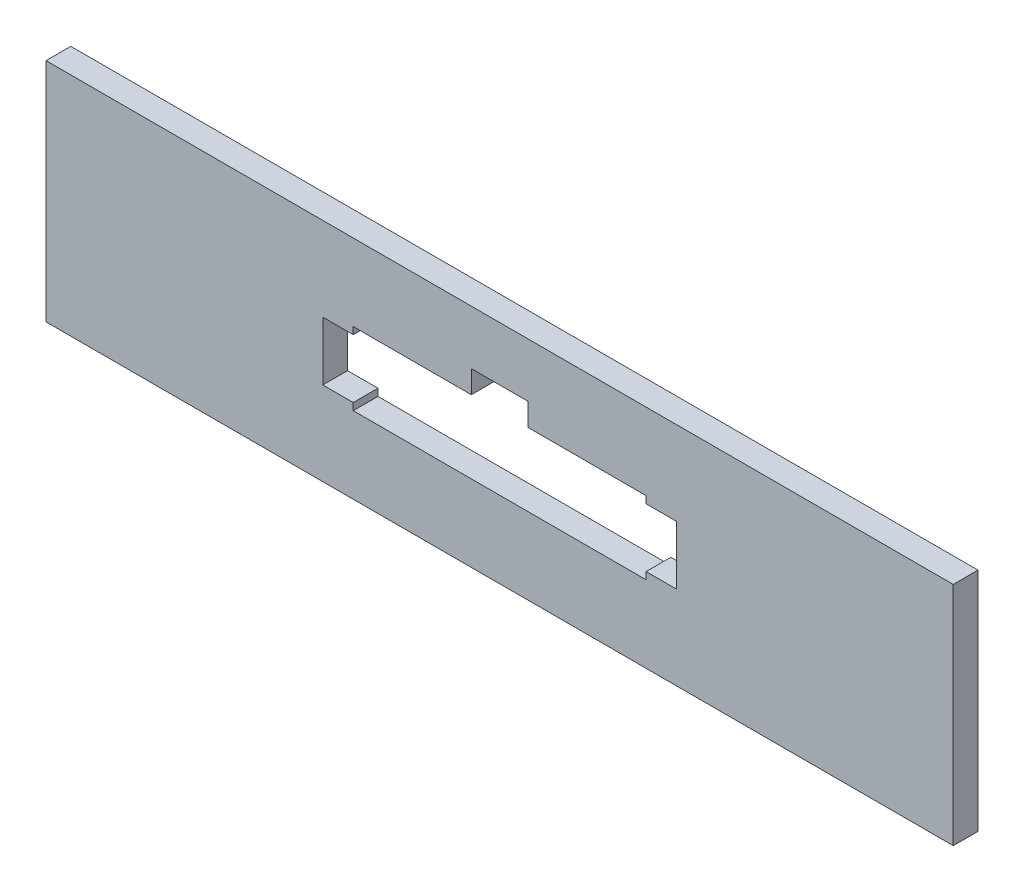
ISO-10303-21;
HEADER;
FILE_DESCRIPTION(('STEP AP214'),'2;1');
FILE_NAME('part.step','',(''),(''),'','','');
FILE_SCHEMA(('AUTOMOTIVE_DESIGN { 1 0 10303 214 1 1 1 1 }'));
ENDSEC;
DATA;
#1=APPLICATION_CONTEXT('core data for automotive mechanical design processes');
#2=APPLICATION_PROTOCOL_DEFINITION('international standard','automotive_design',2000,#1);
#3=PRODUCT_CONTEXT('',#1,'mechanical');
#4=PRODUCT('Part','Part','',(#3));
#5=PRODUCT_RELATED_PRODUCT_CATEGORY('part','',(#4));
#6=PRODUCT_DEFINITION_FORMATION('','',#4);
#7=PRODUCT_DEFINITION_CONTEXT('part definition',#1,'design');
#8=PRODUCT_DEFINITION('design','',#6,#7);
#9=PRODUCT_DEFINITION_SHAPE('','',#8);
#10=(LENGTH_UNIT() NAMED_UNIT(*) SI_UNIT(.MILLI.,.METRE.));
#11=(NAMED_UNIT(*) PLANE_ANGLE_UNIT() SI_UNIT($,.RADIAN.));
#12=(NAMED_UNIT(*) SI_UNIT($,.STERADIAN.) SOLID_ANGLE_UNIT());
#13=UNCERTAINTY_MEASURE_WITH_UNIT(LENGTH_MEASURE(1.E-05),#10,'distance_accuracy_value','');
#14=(GEOMETRIC_REPRESENTATION_CONTEXT(3) GLOBAL_UNCERTAINTY_ASSIGNED_CONTEXT((#13)) GLOBAL_UNIT_ASSIGNED_CONTEXT((#10,
#11,#12)) REPRESENTATION_CONTEXT('',''));
#15=CARTESIAN_POINT('',(0.,0.,0.));
#16=DIRECTION('',(0.,0.,1.));
#17=DIRECTION('',(1.,0.,0.));
#18=AXIS2_PLACEMENT_3D('',#15,#16,#17);
#19=CARTESIAN_POINT('',(0.,0.,1.75));
#20=DIRECTION('',(0.,0.,-1.));
#21=DIRECTION('',(-1.,0.,0.));
#22=AXIS2_PLACEMENT_3D('',#19,#20,#21);
#23=PLANE('',#22);
#24=DIRECTION('',(0.,1.,0.));
#25=VECTOR('',#24,1.);
#26=CARTESIAN_POINT('',(32.0669060003736,-7.99769934349865,1.75));
#27=LINE('',#26,#25);
#28=CARTESIAN_POINT('',(32.0669060003736,-7.99769934349865,1.75));
#29=VERTEX_POINT('',#28);
#30=CARTESIAN_POINT('',(32.0669060003736,7.99769934349865,1.75));
#31=VERTEX_POINT('',#30);
#32=EDGE_CURVE('E291',#29,#31,#27,.T.);
#33=ORIENTED_EDGE('',*,*,#32,.T.);
#34=DIRECTION('',(-1.,0.,0.));
#35=VECTOR('',#34,1.);
#36=CARTESIAN_POINT('',(-32.0669060003736,7.99769934349865,1.75));
#37=LINE('',#36,#35);
#38=CARTESIAN_POINT('',(-32.0669060003736,7.99769934349865,1.75));
#39=VERTEX_POINT('',#38);
#40=EDGE_CURVE('E294',#31,#39,#37,.T.);
#41=ORIENTED_EDGE('',*,*,#40,.T.);
#42=DIRECTION('',(0.,-1.,0.));
#43=VECTOR('',#42,1.);
#44=CARTESIAN_POINT('',(-32.0669060003736,-7.99769934349865,1.75));
#45=LINE('',#44,#43);
#46=CARTESIAN_POINT('',(-32.0669060003736,-7.99769934349865,1.75));
#47=VERTEX_POINT('',#46);
#48=EDGE_CURVE('E297',#39,#47,#45,.T.);
#49=ORIENTED_EDGE('',*,*,#48,.T.);
#50=DIRECTION('',(1.,0.,0.));
#51=VECTOR('',#50,1.);
#52=CARTESIAN_POINT('',(-32.0669060003736,-7.99769934349865,1.75));
#53=LINE('',#52,#51);
#54=EDGE_CURVE('E299',#47,#29,#53,.T.);
#55=ORIENTED_EDGE('',*,*,#54,.T.);
#56=EDGE_LOOP('',(#33,#41,#49,#55));
#57=FACE_BOUND('',#56,.T.);
#58=DIRECTION('',(0.,-1.,0.));
#59=VECTOR('',#58,1.);
#60=CARTESIAN_POINT('',(-10.35,2.075,1.75));
#61=LINE('',#60,#59);
#62=CARTESIAN_POINT('',(-10.35,2.575,1.75));
#63=VERTEX_POINT('',#62);
#64=CARTESIAN_POINT('',(-10.35,2.075,1.75));
#65=VERTEX_POINT('',#64);
#66=EDGE_CURVE('E170',#63,#65,#61,.T.);
#67=ORIENTED_EDGE('',*,*,#66,.F.);
#68=DIRECTION('',(-1.,0.,0.));
#69=VECTOR('',#68,1.);
#70=CARTESIAN_POINT('',(-10.35,2.575,1.75));
#71=LINE('',#70,#69);
#72=CARTESIAN_POINT('',(-2.,2.575,1.75));
#73=VERTEX_POINT('',#72);
#74=EDGE_CURVE('E219',#73,#63,#71,.T.);
#75=ORIENTED_EDGE('',*,*,#74,.F.);
#76=DIRECTION('',(0.,-1.,0.));
#77=VECTOR('',#76,1.);
#78=CARTESIAN_POINT('',(-2.,2.575,1.75));
#79=LINE('',#78,#77);
#80=CARTESIAN_POINT('',(-2.00000000000002,4.17500000000002,1.75));
#81=VERTEX_POINT('',#80);
#82=EDGE_CURVE('E217',#81,#73,#79,.T.);
#83=ORIENTED_EDGE('',*,*,#82,.F.);
#84=DIRECTION('',(-1.,0.,0.));
#85=VECTOR('',#84,1.);
#86=CARTESIAN_POINT('',(-2.00000000000002,4.17500000000002,1.75));
#87=LINE('',#86,#85);
#88=CARTESIAN_POINT('',(1.99999999999998,4.17500000000002,1.75));
#89=VERTEX_POINT('',#88);
#90=EDGE_CURVE('E215',#89,#81,#87,.T.);
#91=ORIENTED_EDGE('',*,*,#90,.F.);
#92=DIRECTION('',(0.,1.,0.));
#93=VECTOR('',#92,1.);
#94=CARTESIAN_POINT('',(2.,2.575,1.75));
#95=LINE('',#94,#93);
#96=CARTESIAN_POINT('',(2.,2.575,1.75));
#97=VERTEX_POINT('',#96);
#98=EDGE_CURVE('E213',#97,#89,#95,.T.);
#99=ORIENTED_EDGE('',*,*,#98,.F.);
#100=DIRECTION('',(-1.,0.,0.));
#101=VECTOR('',#100,1.);
#102=CARTESIAN_POINT('',(2.,2.575,1.75));
#103=LINE('',#102,#101);
#104=CARTESIAN_POINT('',(10.35,2.575,1.75));
#105=VERTEX_POINT('',#104);
#106=EDGE_CURVE('E211',#105,#97,#103,.T.);
#107=ORIENTED_EDGE('',*,*,#106,.F.);
#108=DIRECTION('',(0.,1.,0.));
#109=VECTOR('',#108,1.);
#110=CARTESIAN_POINT('',(10.35,2.075,1.75));
#111=LINE('',#110,#109);
#112=CARTESIAN_POINT('',(10.35,2.075,1.75));
#113=VERTEX_POINT('',#112);
#114=EDGE_CURVE('E209',#113,#105,#111,.T.);
#115=ORIENTED_EDGE('',*,*,#114,.F.);
#116=DIRECTION('',(-1.,0.,0.));
#117=VECTOR('',#116,1.);
#118=CARTESIAN_POINT('',(10.35,2.075,1.75));
#119=LINE('',#118,#117);
#120=CARTESIAN_POINT('',(12.5,2.075,1.75));
#121=VERTEX_POINT('',#120);
#122=EDGE_CURVE('E207',#121,#113,#119,.T.);
#123=ORIENTED_EDGE('',*,*,#122,.F.);
#124=DIRECTION('',(0.,1.,0.));
#125=VECTOR('',#124,1.);
#126=CARTESIAN_POINT('',(12.5,-2.075,1.75));
#127=LINE('',#126,#125);
#128=CARTESIAN_POINT('',(12.5,-2.075,1.75));
#129=VERTEX_POINT('',#128);
#130=EDGE_CURVE('E205',#129,#121,#127,.T.);
#131=ORIENTED_EDGE('',*,*,#130,.F.);
#132=DIRECTION('',(1.,0.,0.));
#133=VECTOR('',#132,1.);
#134=CARTESIAN_POINT('',(10.35,-2.075,1.75));
#135=LINE('',#134,#133);
#136=CARTESIAN_POINT('',(10.35,-2.075,1.75));
#137=VERTEX_POINT('',#136);
#138=EDGE_CURVE('E203',#137,#129,#135,.T.);
#139=ORIENTED_EDGE('',*,*,#138,.F.);
#140=DIRECTION('',(0.,1.,0.));
#141=VECTOR('',#140,1.);
#142=CARTESIAN_POINT('',(10.35,-2.575,1.75));
#143=LINE('',#142,#141);
#144=CARTESIAN_POINT('',(10.35,-2.575,1.75));
#145=VERTEX_POINT('',#144);
#146=EDGE_CURVE('E201',#145,#137,#143,.T.);
#147=ORIENTED_EDGE('',*,*,#146,.F.);
#148=DIRECTION('',(1.,0.,0.));
#149=VECTOR('',#148,1.);
#150=CARTESIAN_POINT('',(-10.35,-2.575,1.75));
#151=LINE('',#150,#149);
#152=CARTESIAN_POINT('',(-10.35,-2.575,1.75));
#153=VERTEX_POINT('',#152);
#154=EDGE_CURVE('E199',#153,#145,#151,.T.);
#155=ORIENTED_EDGE('',*,*,#154,.F.);
#156=DIRECTION('',(0.,-1.,0.));
#157=VECTOR('',#156,1.);
#158=CARTESIAN_POINT('',(-10.35,-2.575,1.75));
#159=LINE('',#158,#157);
#160=CARTESIAN_POINT('',(-10.35,-2.075,1.75));
#161=VERTEX_POINT('',#160);
#162=EDGE_CURVE('E197',#161,#153,#159,.T.);
#163=ORIENTED_EDGE('',*,*,#162,.F.);
#164=DIRECTION('',(1.,0.,0.));
#165=VECTOR('',#164,1.);
#166=CARTESIAN_POINT('',(-12.5,-2.075,1.75));
#167=LINE('',#166,#165);
#168=CARTESIAN_POINT('',(-12.5,-2.075,1.75));
#169=VERTEX_POINT('',#168);
#170=EDGE_CURVE('E193',#169,#161,#167,.T.);
#171=ORIENTED_EDGE('',*,*,#170,.F.);
#172=DIRECTION('',(0.,-1.,0.));
#173=VECTOR('',#172,1.);
#174=CARTESIAN_POINT('',(-12.5,-2.075,1.75));
#175=LINE('',#174,#173);
#176=CARTESIAN_POINT('',(-12.5,2.075,1.75));
#177=VERTEX_POINT('',#176);
#178=EDGE_CURVE('E191',#177,#169,#175,.T.);
#179=ORIENTED_EDGE('',*,*,#178,.F.);
#180=DIRECTION('',(-1.,0.,0.));
#181=VECTOR('',#180,1.);
#182=CARTESIAN_POINT('',(-12.5,2.075,1.75));
#183=LINE('',#182,#181);
#184=EDGE_CURVE('E178',#65,#177,#183,.T.);
#185=ORIENTED_EDGE('',*,*,#184,.F.);
#186=EDGE_LOOP('',(#67,#75,#83,#91,#99,#107,#115,#123,#131,#139,#147,#155,#163,#171,#179,#185));
#187=FACE_BOUND('',#186,.T.);
#188=ADVANCED_FACE('F33',(#57,#187),#23,.F.);
#189=CARTESIAN_POINT('',(0.,0.,0.));
#190=DIRECTION('',(0.,0.,-1.));
#191=DIRECTION('',(-1.,0.,0.));
#192=AXIS2_PLACEMENT_3D('',#189,#190,#191);
#193=PLANE('',#192);
#194=DIRECTION('',(0.,1.,0.));
#195=VECTOR('',#194,1.);
#196=CARTESIAN_POINT('',(32.0669060003736,-7.99769934349865,0.));
#197=LINE('',#196,#195);
#198=CARTESIAN_POINT('',(32.0669060003736,-7.99769934349865,0.));
#199=VERTEX_POINT('',#198);
#200=CARTESIAN_POINT('',(32.0669060003736,7.99769934349865,0.));
#201=VERTEX_POINT('',#200);
#202=EDGE_CURVE('E186',#199,#201,#197,.T.);
#203=ORIENTED_EDGE('',*,*,#202,.F.);
#204=DIRECTION('',(1.,0.,0.));
#205=VECTOR('',#204,1.);
#206=CARTESIAN_POINT('',(-32.0669060003736,-7.99769934349865,0.));
#207=LINE('',#206,#205);
#208=CARTESIAN_POINT('',(-32.0669060003736,-7.99769934349865,0.));
#209=VERTEX_POINT('',#208);
#210=EDGE_CURVE('E295',#209,#199,#207,.T.);
#211=ORIENTED_EDGE('',*,*,#210,.F.);
#212=DIRECTION('',(0.,-1.,0.));
#213=VECTOR('',#212,1.);
#214=CARTESIAN_POINT('',(-32.0669060003736,-7.99769934349865,0.));
#215=LINE('',#214,#213);
#216=CARTESIAN_POINT('',(-32.0669060003736,7.99769934349865,0.));
#217=VERTEX_POINT('',#216);
#218=EDGE_CURVE('E306',#217,#209,#215,.T.);
#219=ORIENTED_EDGE('',*,*,#218,.F.);
#220=DIRECTION('',(-1.,0.,0.));
#221=VECTOR('',#220,1.);
#222=CARTESIAN_POINT('',(-32.0669060003736,7.99769934349865,0.));
#223=LINE('',#222,#221);
#224=EDGE_CURVE('E304',#201,#217,#223,.T.);
#225=ORIENTED_EDGE('',*,*,#224,.F.);
#226=EDGE_LOOP('',(#203,#211,#219,#225));
#227=FACE_BOUND('',#226,.T.);
#228=DIRECTION('',(-1.,0.,0.));
#229=VECTOR('',#228,1.);
#230=CARTESIAN_POINT('',(-10.35,2.575,0.));
#231=LINE('',#230,#229);
#232=CARTESIAN_POINT('',(-2.,2.575,0.));
#233=VERTEX_POINT('',#232);
#234=CARTESIAN_POINT('',(-10.35,2.575,0.));
#235=VERTEX_POINT('',#234);
#236=EDGE_CURVE('E179',#233,#235,#231,.T.);
#237=ORIENTED_EDGE('',*,*,#236,.T.);
#238=DIRECTION('',(0.,-1.,0.));
#239=VECTOR('',#238,1.);
#240=CARTESIAN_POINT('',(-10.35,2.075,0.));
#241=LINE('',#240,#239);
#242=CARTESIAN_POINT('',(-10.35,2.075,0.));
#243=VERTEX_POINT('',#242);
#244=EDGE_CURVE('E56',#235,#243,#241,.T.);
#245=ORIENTED_EDGE('',*,*,#244,.T.);
#246=DIRECTION('',(-1.,0.,0.));
#247=VECTOR('',#246,1.);
#248=CARTESIAN_POINT('',(-12.5,2.075,0.));
#249=LINE('',#248,#247);
#250=CARTESIAN_POINT('',(-12.5,2.075,0.));
#251=VERTEX_POINT('',#250);
#252=EDGE_CURVE('E185',#243,#251,#249,.T.);
#253=ORIENTED_EDGE('',*,*,#252,.T.);
#254=DIRECTION('',(0.,-1.,0.));
#255=VECTOR('',#254,1.);
#256=CARTESIAN_POINT('',(-12.5,-2.075,0.));
#257=LINE('',#256,#255);
#258=CARTESIAN_POINT('',(-12.5,-2.075,0.));
#259=VERTEX_POINT('',#258);
#260=EDGE_CURVE('E223',#251,#259,#257,.T.);
#261=ORIENTED_EDGE('',*,*,#260,.T.);
#262=DIRECTION('',(1.,0.,0.));
#263=VECTOR('',#262,1.);
#264=CARTESIAN_POINT('',(-12.5,-2.075,0.));
#265=LINE('',#264,#263);
#266=CARTESIAN_POINT('',(-10.35,-2.075,0.));
#267=VERTEX_POINT('',#266);
#268=EDGE_CURVE('E226',#259,#267,#265,.T.);
#269=ORIENTED_EDGE('',*,*,#268,.T.);
#270=DIRECTION('',(0.,-1.,0.));
#271=VECTOR('',#270,1.);
#272=CARTESIAN_POINT('',(-10.35,-2.575,0.));
#273=LINE('',#272,#271);
#274=CARTESIAN_POINT('',(-10.35,-2.575,0.));
#275=VERTEX_POINT('',#274);
#276=EDGE_CURVE('E229',#267,#275,#273,.T.);
#277=ORIENTED_EDGE('',*,*,#276,.T.);
#278=DIRECTION('',(1.,0.,0.));
#279=VECTOR('',#278,1.);
#280=CARTESIAN_POINT('',(-10.35,-2.575,0.));
#281=LINE('',#280,#279);
#282=CARTESIAN_POINT('',(10.35,-2.575,0.));
#283=VERTEX_POINT('',#282);
#284=EDGE_CURVE('E232',#275,#283,#281,.T.);
#285=ORIENTED_EDGE('',*,*,#284,.T.);
#286=DIRECTION('',(0.,1.,0.));
#287=VECTOR('',#286,1.);
#288=CARTESIAN_POINT('',(10.35,-2.575,0.));
#289=LINE('',#288,#287);
#290=CARTESIAN_POINT('',(10.35,-2.075,0.));
#291=VERTEX_POINT('',#290);
#292=EDGE_CURVE('E235',#283,#291,#289,.T.);
#293=ORIENTED_EDGE('',*,*,#292,.T.);
#294=DIRECTION('',(1.,0.,0.));
#295=VECTOR('',#294,1.);
#296=CARTESIAN_POINT('',(10.35,-2.075,0.));
#297=LINE('',#296,#295);
#298=CARTESIAN_POINT('',(12.5,-2.075,0.));
#299=VERTEX_POINT('',#298);
#300=EDGE_CURVE('E238',#291,#299,#297,.T.);
#301=ORIENTED_EDGE('',*,*,#300,.T.);
#302=DIRECTION('',(0.,1.,0.));
#303=VECTOR('',#302,1.);
#304=CARTESIAN_POINT('',(12.5,-2.075,0.));
#305=LINE('',#304,#303);
#306=CARTESIAN_POINT('',(12.5,2.075,0.));
#307=VERTEX_POINT('',#306);
#308=EDGE_CURVE('E241',#299,#307,#305,.T.);
#309=ORIENTED_EDGE('',*,*,#308,.T.);
#310=DIRECTION('',(-1.,0.,0.));
#311=VECTOR('',#310,1.);
#312=CARTESIAN_POINT('',(10.35,2.075,0.));
#313=LINE('',#312,#311);
#314=CARTESIAN_POINT('',(10.35,2.075,0.));
#315=VERTEX_POINT('',#314);
#316=EDGE_CURVE('E244',#307,#315,#313,.T.);
#317=ORIENTED_EDGE('',*,*,#316,.T.);
#318=DIRECTION('',(0.,1.,0.));
#319=VECTOR('',#318,1.);
#320=CARTESIAN_POINT('',(10.35,2.075,0.));
#321=LINE('',#320,#319);
#322=CARTESIAN_POINT('',(10.35,2.575,0.));
#323=VERTEX_POINT('',#322);
#324=EDGE_CURVE('E247',#315,#323,#321,.T.);
#325=ORIENTED_EDGE('',*,*,#324,.T.);
#326=DIRECTION('',(-1.,0.,0.));
#327=VECTOR('',#326,1.);
#328=CARTESIAN_POINT('',(2.,2.575,0.));
#329=LINE('',#328,#327);
#330=CARTESIAN_POINT('',(2.,2.575,0.));
#331=VERTEX_POINT('',#330);
#332=EDGE_CURVE('E250',#323,#331,#329,.T.);
#333=ORIENTED_EDGE('',*,*,#332,.T.);
#334=DIRECTION('',(0.,1.,0.));
#335=VECTOR('',#334,1.);
#336=CARTESIAN_POINT('',(2.,2.575,0.));
#337=LINE('',#336,#335);
#338=CARTESIAN_POINT('',(1.99999999999998,4.17500000000002,0.));
#339=VERTEX_POINT('',#338);
#340=EDGE_CURVE('E253',#331,#339,#337,.T.);
#341=ORIENTED_EDGE('',*,*,#340,.T.);
#342=DIRECTION('',(-1.,0.,0.));
#343=VECTOR('',#342,1.);
#344=CARTESIAN_POINT('',(-2.00000000000002,4.17500000000002,0.));
#345=LINE('',#344,#343);
#346=CARTESIAN_POINT('',(-2.00000000000002,4.17500000000002,0.));
#347=VERTEX_POINT('',#346);
#348=EDGE_CURVE('E256',#339,#347,#345,.T.);
#349=ORIENTED_EDGE('',*,*,#348,.T.);
#350=DIRECTION('',(0.,-1.,0.));
#351=VECTOR('',#350,1.);
#352=CARTESIAN_POINT('',(-2.,2.575,0.));
#353=LINE('',#352,#351);
#354=EDGE_CURVE('E259',#347,#233,#353,.T.);
#355=ORIENTED_EDGE('',*,*,#354,.T.);
#356=EDGE_LOOP('',(#237,#245,#253,#261,#269,#277,#285,#293,#301,#309,#317,#325,#333,#341,#349,#355));
#357=FACE_BOUND('',#356,.T.);
#358=ADVANCED_FACE('F324',(#227,#357),#193,.T.);
#359=CARTESIAN_POINT('',(32.0669060003736,-7.99769934349865,1.75));
#360=DIRECTION('',(-1.,0.,0.));
#361=DIRECTION('',(0.,0.,1.));
#362=AXIS2_PLACEMENT_3D('',#359,#360,#361);
#363=PLANE('',#362);
#364=ORIENTED_EDGE('',*,*,#202,.T.);
#365=DIRECTION('',(0.,0.,-1.));
#366=VECTOR('',#365,1.);
#367=CARTESIAN_POINT('',(32.0669060003736,7.99769934349865,1.75));
#368=LINE('',#367,#366);
#369=EDGE_CURVE('E11',#31,#201,#368,.T.);
#370=ORIENTED_EDGE('',*,*,#369,.F.);
#371=ORIENTED_EDGE('',*,*,#32,.F.);
#372=DIRECTION('',(0.,0.,-1.));
#373=VECTOR('',#372,1.);
#374=CARTESIAN_POINT('',(32.0669060003736,-7.99769934349865,1.75));
#375=LINE('',#374,#373);
#376=EDGE_CURVE('E301',#29,#199,#375,.T.);
#377=ORIENTED_EDGE('',*,*,#376,.T.);
#378=EDGE_LOOP('',(#364,#370,#371,#377));
#379=FACE_BOUND('',#378,.T.);
#380=ADVANCED_FACE('F35',(#379),#363,.F.);
#381=CARTESIAN_POINT('',(-32.0669060003736,7.99769934349865,1.75));
#382=DIRECTION('',(0.,-1.,0.));
#383=DIRECTION('',(0.,0.,-1.));
#384=AXIS2_PLACEMENT_3D('',#381,#382,#383);
#385=PLANE('',#384);
#386=ORIENTED_EDGE('',*,*,#224,.T.);
#387=DIRECTION('',(0.,0.,-1.));
#388=VECTOR('',#387,1.);
#389=CARTESIAN_POINT('',(-32.0669060003736,7.99769934349865,1.75));
#390=LINE('',#389,#388);
#391=EDGE_CURVE('E41',#39,#217,#390,.T.);
#392=ORIENTED_EDGE('',*,*,#391,.F.);
#393=ORIENTED_EDGE('',*,*,#40,.F.);
#394=ORIENTED_EDGE('',*,*,#369,.T.);
#395=EDGE_LOOP('',(#386,#392,#393,#394));
#396=FACE_BOUND('',#395,.T.);
#397=ADVANCED_FACE('F334',(#396),#385,.F.);
#398=CARTESIAN_POINT('',(-32.0669060003736,-7.99769934349865,1.75));
#399=DIRECTION('',(1.,0.,0.));
#400=DIRECTION('',(0.,0.,-1.));
#401=AXIS2_PLACEMENT_3D('',#398,#399,#400);
#402=PLANE('',#401);
#403=ORIENTED_EDGE('',*,*,#218,.T.);
#404=DIRECTION('',(0.,0.,-1.));
#405=VECTOR('',#404,1.);
#406=CARTESIAN_POINT('',(-32.0669060003736,-7.99769934349865,1.75));
#407=LINE('',#406,#405);
#408=EDGE_CURVE('E311',#47,#209,#407,.T.);
#409=ORIENTED_EDGE('',*,*,#408,.F.);
#410=ORIENTED_EDGE('',*,*,#48,.F.);
#411=ORIENTED_EDGE('',*,*,#391,.T.);
#412=EDGE_LOOP('',(#403,#409,#410,#411));
#413=FACE_BOUND('',#412,.T.);
#414=ADVANCED_FACE('F318',(#413),#402,.F.);
#415=CARTESIAN_POINT('',(-32.0669060003736,-7.99769934349865,1.75));
#416=DIRECTION('',(0.,1.,0.));
#417=DIRECTION('',(0.,0.,1.));
#418=AXIS2_PLACEMENT_3D('',#415,#416,#417);
#419=PLANE('',#418);
#420=ORIENTED_EDGE('',*,*,#210,.T.);
#421=ORIENTED_EDGE('',*,*,#376,.F.);
#422=ORIENTED_EDGE('',*,*,#54,.F.);
#423=ORIENTED_EDGE('',*,*,#408,.T.);
#424=EDGE_LOOP('',(#420,#421,#422,#423));
#425=FACE_BOUND('',#424,.T.);
#426=ADVANCED_FACE('F328',(#425),#419,.F.);
#427=CARTESIAN_POINT('',(-10.35,2.075,1.75));
#428=DIRECTION('',(1.,0.,0.));
#429=DIRECTION('',(0.,0.,-1.));
#430=AXIS2_PLACEMENT_3D('',#427,#428,#429);
#431=PLANE('',#430);
#432=ORIENTED_EDGE('',*,*,#244,.F.);
#433=DIRECTION('',(0.,0.,-1.));
#434=VECTOR('',#433,1.);
#435=CARTESIAN_POINT('',(-10.35,2.575,1.75));
#436=LINE('',#435,#434);
#437=EDGE_CURVE('E174',#63,#235,#436,.T.);
#438=ORIENTED_EDGE('',*,*,#437,.F.);
#439=ORIENTED_EDGE('',*,*,#66,.T.);
#440=DIRECTION('',(0.,0.,-1.));
#441=VECTOR('',#440,1.);
#442=CARTESIAN_POINT('',(-10.35,2.075,1.75));
#443=LINE('',#442,#441);
#444=EDGE_CURVE('E173',#65,#243,#443,.T.);
#445=ORIENTED_EDGE('',*,*,#444,.T.);
#446=EDGE_LOOP('',(#432,#438,#439,#445));
#447=FACE_BOUND('',#446,.T.);
#448=ADVANCED_FACE('F172',(#447),#431,.T.);
#449=CARTESIAN_POINT('',(-12.5,2.075,1.75));
#450=DIRECTION('',(0.,-1.,0.));
#451=DIRECTION('',(1.,0.,0.));
#452=AXIS2_PLACEMENT_3D('',#449,#450,#451);
#453=PLANE('',#452);
#454=ORIENTED_EDGE('',*,*,#252,.F.);
#455=ORIENTED_EDGE('',*,*,#444,.F.);
#456=ORIENTED_EDGE('',*,*,#184,.T.);
#457=DIRECTION('',(0.,0.,-1.));
#458=VECTOR('',#457,1.);
#459=CARTESIAN_POINT('',(-12.5,2.075,1.75));
#460=LINE('',#459,#458);
#461=EDGE_CURVE('E187',#177,#251,#460,.T.);
#462=ORIENTED_EDGE('',*,*,#461,.T.);
#463=EDGE_LOOP('',(#454,#455,#456,#462));
#464=FACE_BOUND('',#463,.T.);
#465=ADVANCED_FACE('F182',(#464),#453,.T.);
#466=CARTESIAN_POINT('',(-12.5,-2.075,1.75));
#467=DIRECTION('',(1.,0.,0.));
#468=DIRECTION('',(0.,0.,-1.));
#469=AXIS2_PLACEMENT_3D('',#466,#467,#468);
#470=PLANE('',#469);
#471=ORIENTED_EDGE('',*,*,#260,.F.);
#472=ORIENTED_EDGE('',*,*,#461,.F.);
#473=ORIENTED_EDGE('',*,*,#178,.T.);
#474=DIRECTION('',(0.,0.,-1.));
#475=VECTOR('',#474,1.);
#476=CARTESIAN_POINT('',(-12.5,-2.075,1.75));
#477=LINE('',#476,#475);
#478=EDGE_CURVE('E288',#169,#259,#477,.T.);
#479=ORIENTED_EDGE('',*,*,#478,.T.);
#480=EDGE_LOOP('',(#471,#472,#473,#479));
#481=FACE_BOUND('',#480,.T.);
#482=ADVANCED_FACE('F357',(#481),#470,.T.);
#483=CARTESIAN_POINT('',(-12.5,-2.075,1.75));
#484=DIRECTION('',(0.,1.,0.));
#485=DIRECTION('',(-1.,0.,0.));
#486=AXIS2_PLACEMENT_3D('',#483,#484,#485);
#487=PLANE('',#486);
#488=ORIENTED_EDGE('',*,*,#268,.F.);
#489=ORIENTED_EDGE('',*,*,#478,.F.);
#490=ORIENTED_EDGE('',*,*,#170,.T.);
#491=DIRECTION('',(0.,0.,-1.));
#492=VECTOR('',#491,1.);
#493=CARTESIAN_POINT('',(-10.35,-2.075,1.75));
#494=LINE('',#493,#492);
#495=EDGE_CURVE('E286',#161,#267,#494,.T.);
#496=ORIENTED_EDGE('',*,*,#495,.T.);
#497=EDGE_LOOP('',(#488,#489,#490,#496));
#498=FACE_BOUND('',#497,.T.);
#499=ADVANCED_FACE('F361',(#498),#487,.T.);
#500=CARTESIAN_POINT('',(-10.35,-2.575,1.75));
#501=DIRECTION('',(1.,0.,0.));
#502=DIRECTION('',(0.,0.,-1.));
#503=AXIS2_PLACEMENT_3D('',#500,#501,#502);
#504=PLANE('',#503);
#505=ORIENTED_EDGE('',*,*,#276,.F.);
#506=ORIENTED_EDGE('',*,*,#495,.F.);
#507=ORIENTED_EDGE('',*,*,#162,.T.);
#508=DIRECTION('',(0.,0.,-1.));
#509=VECTOR('',#508,1.);
#510=CARTESIAN_POINT('',(-10.35,-2.575,1.75));
#511=LINE('',#510,#509);
#512=EDGE_CURVE('E284',#153,#275,#511,.T.);
#513=ORIENTED_EDGE('',*,*,#512,.T.);
#514=EDGE_LOOP('',(#505,#506,#507,#513));
#515=FACE_BOUND('',#514,.T.);
#516=ADVANCED_FACE('F367',(#515),#504,.T.);
#517=CARTESIAN_POINT('',(-10.35,-2.575,1.75));
#518=DIRECTION('',(0.,1.,0.));
#519=DIRECTION('',(0.,0.,1.));
#520=AXIS2_PLACEMENT_3D('',#517,#518,#519);
#521=PLANE('',#520);
#522=ORIENTED_EDGE('',*,*,#284,.F.);
#523=ORIENTED_EDGE('',*,*,#512,.F.);
#524=ORIENTED_EDGE('',*,*,#154,.T.);
#525=DIRECTION('',(0.,0.,-1.));
#526=VECTOR('',#525,1.);
#527=CARTESIAN_POINT('',(10.35,-2.575,1.75));
#528=LINE('',#527,#526);
#529=EDGE_CURVE('E282',#145,#283,#528,.T.);
#530=ORIENTED_EDGE('',*,*,#529,.T.);
#531=EDGE_LOOP('',(#522,#523,#524,#530));
#532=FACE_BOUND('',#531,.T.);
#533=ADVANCED_FACE('F371',(#532),#521,.T.);
#534=CARTESIAN_POINT('',(10.35,-2.575,1.75));
#535=DIRECTION('',(-1.,0.,0.));
#536=DIRECTION('',(0.,0.,1.));
#537=AXIS2_PLACEMENT_3D('',#534,#535,#536);
#538=PLANE('',#537);
#539=ORIENTED_EDGE('',*,*,#292,.F.);
#540=ORIENTED_EDGE('',*,*,#529,.F.);
#541=ORIENTED_EDGE('',*,*,#146,.T.);
#542=DIRECTION('',(0.,0.,-1.));
#543=VECTOR('',#542,1.);
#544=CARTESIAN_POINT('',(10.35,-2.075,1.75));
#545=LINE('',#544,#543);
#546=EDGE_CURVE('E280',#137,#291,#545,.T.);
#547=ORIENTED_EDGE('',*,*,#546,.T.);
#548=EDGE_LOOP('',(#539,#540,#541,#547));
#549=FACE_BOUND('',#548,.T.);
#550=ADVANCED_FACE('F375',(#549),#538,.T.);
#551=CARTESIAN_POINT('',(10.35,-2.075,1.75));
#552=DIRECTION('',(0.,1.,0.));
#553=DIRECTION('',(-1.,0.,0.));
#554=AXIS2_PLACEMENT_3D('',#551,#552,#553);
#555=PLANE('',#554);
#556=ORIENTED_EDGE('',*,*,#300,.F.);
#557=ORIENTED_EDGE('',*,*,#546,.F.);
#558=ORIENTED_EDGE('',*,*,#138,.T.);
#559=DIRECTION('',(0.,0.,-1.));
#560=VECTOR('',#559,1.);
#561=CARTESIAN_POINT('',(12.5,-2.075,1.75));
#562=LINE('',#561,#560);
#563=EDGE_CURVE('E278',#129,#299,#562,.T.);
#564=ORIENTED_EDGE('',*,*,#563,.T.);
#565=EDGE_LOOP('',(#556,#557,#558,#564));
#566=FACE_BOUND('',#565,.T.);
#567=ADVANCED_FACE('F379',(#566),#555,.T.);
#568=CARTESIAN_POINT('',(12.5,-2.075,1.75));
#569=DIRECTION('',(-1.,0.,0.));
#570=DIRECTION('',(0.,0.,1.));
#571=AXIS2_PLACEMENT_3D('',#568,#569,#570);
#572=PLANE('',#571);
#573=ORIENTED_EDGE('',*,*,#308,.F.);
#574=ORIENTED_EDGE('',*,*,#563,.F.);
#575=ORIENTED_EDGE('',*,*,#130,.T.);
#576=DIRECTION('',(0.,0.,-1.));
#577=VECTOR('',#576,1.);
#578=CARTESIAN_POINT('',(12.5,2.075,1.75));
#579=LINE('',#578,#577);
#580=EDGE_CURVE('E276',#121,#307,#579,.T.);
#581=ORIENTED_EDGE('',*,*,#580,.T.);
#582=EDGE_LOOP('',(#573,#574,#575,#581));
#583=FACE_BOUND('',#582,.T.);
#584=ADVANCED_FACE('F383',(#583),#572,.T.);
#585=CARTESIAN_POINT('',(10.35,2.075,1.75));
#586=DIRECTION('',(0.,-1.,0.));
#587=DIRECTION('',(1.,0.,0.));
#588=AXIS2_PLACEMENT_3D('',#585,#586,#587);
#589=PLANE('',#588);
#590=ORIENTED_EDGE('',*,*,#316,.F.);
#591=ORIENTED_EDGE('',*,*,#580,.F.);
#592=ORIENTED_EDGE('',*,*,#122,.T.);
#593=DIRECTION('',(0.,0.,-1.));
#594=VECTOR('',#593,1.);
#595=CARTESIAN_POINT('',(10.35,2.075,1.75));
#596=LINE('',#595,#594);
#597=EDGE_CURVE('E274',#113,#315,#596,.T.);
#598=ORIENTED_EDGE('',*,*,#597,.T.);
#599=EDGE_LOOP('',(#590,#591,#592,#598));
#600=FACE_BOUND('',#599,.T.);
#601=ADVANCED_FACE('F387',(#600),#589,.T.);
#602=CARTESIAN_POINT('',(10.35,2.075,1.75));
#603=DIRECTION('',(-1.,0.,0.));
#604=DIRECTION('',(0.,0.,1.));
#605=AXIS2_PLACEMENT_3D('',#602,#603,#604);
#606=PLANE('',#605);
#607=ORIENTED_EDGE('',*,*,#324,.F.);
#608=ORIENTED_EDGE('',*,*,#597,.F.);
#609=ORIENTED_EDGE('',*,*,#114,.T.);
#610=DIRECTION('',(0.,0.,-1.));
#611=VECTOR('',#610,1.);
#612=CARTESIAN_POINT('',(10.35,2.575,1.75));
#613=LINE('',#612,#611);
#614=EDGE_CURVE('E272',#105,#323,#613,.T.);
#615=ORIENTED_EDGE('',*,*,#614,.T.);
#616=EDGE_LOOP('',(#607,#608,#609,#615));
#617=FACE_BOUND('',#616,.T.);
#618=ADVANCED_FACE('F391',(#617),#606,.T.);
#619=CARTESIAN_POINT('',(2.,2.575,1.75));
#620=DIRECTION('',(0.,-1.,0.));
#621=DIRECTION('',(0.,0.,-1.));
#622=AXIS2_PLACEMENT_3D('',#619,#620,#621);
#623=PLANE('',#622);
#624=ORIENTED_EDGE('',*,*,#332,.F.);
#625=ORIENTED_EDGE('',*,*,#614,.F.);
#626=ORIENTED_EDGE('',*,*,#106,.T.);
#627=DIRECTION('',(0.,0.,-1.));
#628=VECTOR('',#627,1.);
#629=CARTESIAN_POINT('',(2.,2.575,1.75));
#630=LINE('',#629,#628);
#631=EDGE_CURVE('E270',#97,#331,#630,.T.);
#632=ORIENTED_EDGE('',*,*,#631,.T.);
#633=EDGE_LOOP('',(#624,#625,#626,#632));
#634=FACE_BOUND('',#633,.T.);
#635=ADVANCED_FACE('F395',(#634),#623,.T.);
#636=CARTESIAN_POINT('',(2.,2.575,1.75));
#637=DIRECTION('',(-1.,0.,0.));
#638=DIRECTION('',(0.,-1.,0.));
#639=AXIS2_PLACEMENT_3D('',#636,#637,#638);
#640=PLANE('',#639);
#641=ORIENTED_EDGE('',*,*,#340,.F.);
#642=ORIENTED_EDGE('',*,*,#631,.F.);
#643=ORIENTED_EDGE('',*,*,#98,.T.);
#644=DIRECTION('',(0.,0.,-1.));
#645=VECTOR('',#644,1.);
#646=CARTESIAN_POINT('',(1.99999999999998,4.17500000000002,1.75));
#647=LINE('',#646,#645);
#648=EDGE_CURVE('E268',#89,#339,#647,.T.);
#649=ORIENTED_EDGE('',*,*,#648,.T.);
#650=EDGE_LOOP('',(#641,#642,#643,#649));
#651=FACE_BOUND('',#650,.T.);
#652=ADVANCED_FACE('F399',(#651),#640,.T.);
#653=CARTESIAN_POINT('',(-2.00000000000002,4.17500000000002,1.75));
#654=DIRECTION('',(0.,-1.,0.));
#655=DIRECTION('',(1.,0.,0.));
#656=AXIS2_PLACEMENT_3D('',#653,#654,#655);
#657=PLANE('',#656);
#658=ORIENTED_EDGE('',*,*,#348,.F.);
#659=ORIENTED_EDGE('',*,*,#648,.F.);
#660=ORIENTED_EDGE('',*,*,#90,.T.);
#661=DIRECTION('',(0.,0.,-1.));
#662=VECTOR('',#661,1.);
#663=CARTESIAN_POINT('',(-2.00000000000002,4.17500000000002,1.75));
#664=LINE('',#663,#662);
#665=EDGE_CURVE('E266',#81,#347,#664,.T.);
#666=ORIENTED_EDGE('',*,*,#665,.T.);
#667=EDGE_LOOP('',(#658,#659,#660,#666));
#668=FACE_BOUND('',#667,.T.);
#669=ADVANCED_FACE('F403',(#668),#657,.T.);
#670=CARTESIAN_POINT('',(-2.,2.575,1.75));
#671=DIRECTION('',(1.,0.,0.));
#672=DIRECTION('',(0.,1.,0.));
#673=AXIS2_PLACEMENT_3D('',#670,#671,#672);
#674=PLANE('',#673);
#675=ORIENTED_EDGE('',*,*,#354,.F.);
#676=ORIENTED_EDGE('',*,*,#665,.F.);
#677=ORIENTED_EDGE('',*,*,#82,.T.);
#678=DIRECTION('',(0.,0.,-1.));
#679=VECTOR('',#678,1.);
#680=CARTESIAN_POINT('',(-2.,2.575,1.75));
#681=LINE('',#680,#679);
#682=EDGE_CURVE('E48',#73,#233,#681,.T.);
#683=ORIENTED_EDGE('',*,*,#682,.T.);
#684=EDGE_LOOP('',(#675,#676,#677,#683));
#685=FACE_BOUND('',#684,.T.);
#686=ADVANCED_FACE('F407',(#685),#674,.T.);
#687=CARTESIAN_POINT('',(-10.35,2.575,1.75));
#688=DIRECTION('',(0.,-1.,0.));
#689=DIRECTION('',(0.,0.,-1.));
#690=AXIS2_PLACEMENT_3D('',#687,#688,#689);
#691=PLANE('',#690);
#692=ORIENTED_EDGE('',*,*,#236,.F.);
#693=ORIENTED_EDGE('',*,*,#682,.F.);
#694=ORIENTED_EDGE('',*,*,#74,.T.);
#695=ORIENTED_EDGE('',*,*,#437,.T.);
#696=EDGE_LOOP('',(#692,#693,#694,#695));
#697=FACE_BOUND('',#696,.T.);
#698=ADVANCED_FACE('F411',(#697),#691,.T.);
#699=CLOSED_SHELL('',(#188,#358,#380,#397,#414,#426,#448,#465,#482,#499,#516,#533,#550,#567,
#584,#601,#618,#635,#652,#669,#686,#698));
#700=MANIFOLD_SOLID_BREP('B2',#699);
#701=ADVANCED_BREP_SHAPE_REPRESENTATION('',(#18,#700),#14);
#702=SHAPE_DEFINITION_REPRESENTATION(#9,#701);
ENDSEC;
END-ISO-10303-21;
